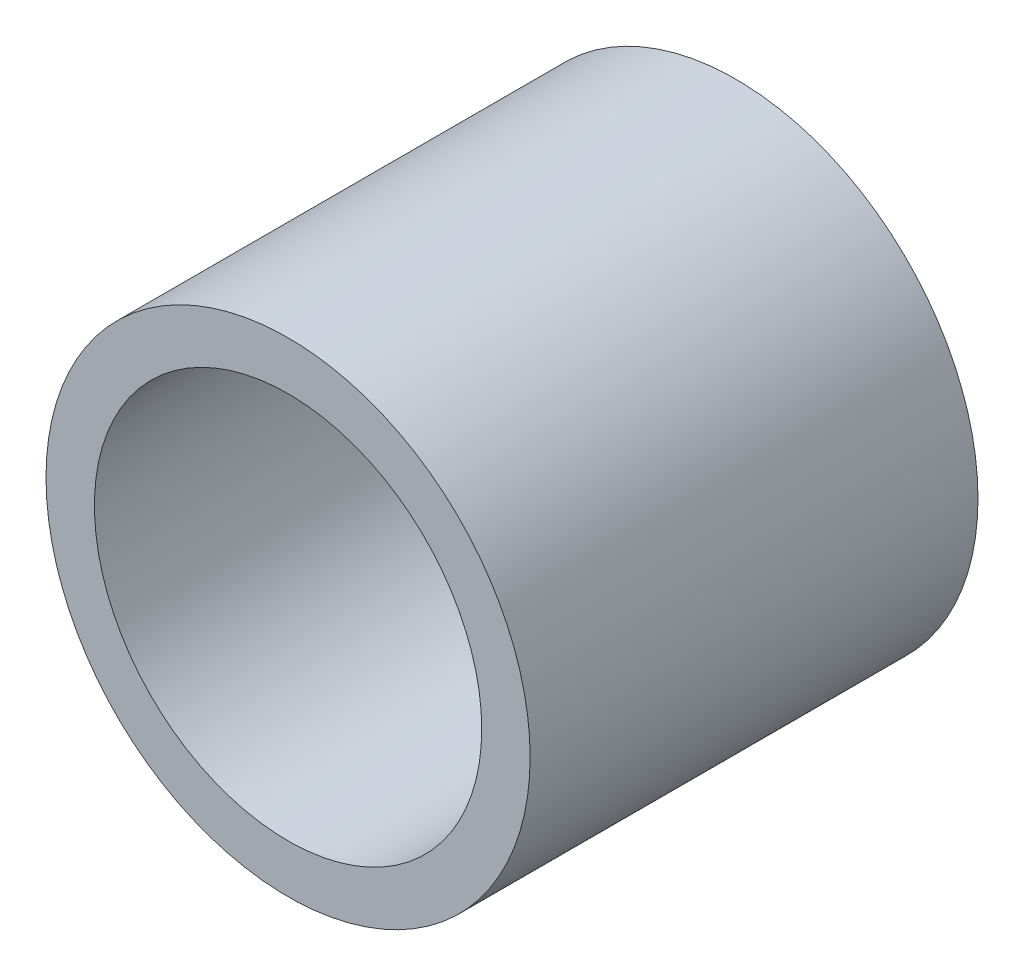
ISO-10303-21;
HEADER;
FILE_DESCRIPTION(('STEP AP214'),'2;1');
FILE_NAME('part.step','',(''),(''),'','','');
FILE_SCHEMA(('AUTOMOTIVE_DESIGN { 1 0 10303 214 1 1 1 1 }'));
ENDSEC;
DATA;
#1=APPLICATION_CONTEXT('core data for automotive mechanical design processes');
#2=APPLICATION_PROTOCOL_DEFINITION('international standard','automotive_design',2000,#1);
#3=PRODUCT_CONTEXT('',#1,'mechanical');
#4=PRODUCT('Part','Part','',(#3));
#5=PRODUCT_RELATED_PRODUCT_CATEGORY('part','',(#4));
#6=PRODUCT_DEFINITION_FORMATION('','',#4);
#7=PRODUCT_DEFINITION_CONTEXT('part definition',#1,'design');
#8=PRODUCT_DEFINITION('design','',#6,#7);
#9=PRODUCT_DEFINITION_SHAPE('','',#8);
#10=(LENGTH_UNIT() NAMED_UNIT(*) SI_UNIT(.MILLI.,.METRE.));
#11=(NAMED_UNIT(*) PLANE_ANGLE_UNIT() SI_UNIT($,.RADIAN.));
#12=(NAMED_UNIT(*) SI_UNIT($,.STERADIAN.) SOLID_ANGLE_UNIT());
#13=UNCERTAINTY_MEASURE_WITH_UNIT(LENGTH_MEASURE(1.E-05),#10,'distance_accuracy_value','');
#14=(GEOMETRIC_REPRESENTATION_CONTEXT(3) GLOBAL_UNCERTAINTY_ASSIGNED_CONTEXT((#13)) GLOBAL_UNIT_ASSIGNED_CONTEXT((#10,
#11,#12)) REPRESENTATION_CONTEXT('',''));
#15=CARTESIAN_POINT('',(0.,0.,0.));
#16=DIRECTION('',(0.,0.,1.));
#17=DIRECTION('',(1.,0.,0.));
#18=AXIS2_PLACEMENT_3D('',#15,#16,#17);
#19=CARTESIAN_POINT('',(0.,0.,9.25));
#20=DIRECTION('',(0.,0.,1.));
#21=DIRECTION('',(1.,0.,0.));
#22=AXIS2_PLACEMENT_3D('',#19,#20,#21);
#23=PLANE('',#22);
#24=CARTESIAN_POINT('',(0.,0.,9.25));
#25=DIRECTION('',(0.,0.,1.));
#26=DIRECTION('',(1.,0.,0.));
#27=AXIS2_PLACEMENT_3D('',#24,#25,#26);
#28=CIRCLE('',#27,5.);
#29=CARTESIAN_POINT('',(5.,0.,9.25));
#30=VERTEX_POINT('',#29);
#31=EDGE_CURVE('E11',#30,#30,#28,.T.);
#32=ORIENTED_EDGE('',*,*,#31,.T.);
#33=EDGE_LOOP('',(#32));
#34=FACE_BOUND('',#33,.T.);
#35=CARTESIAN_POINT('',(0.,0.,9.25));
#36=DIRECTION('',(0.,0.,1.));
#37=DIRECTION('',(1.,0.,0.));
#38=AXIS2_PLACEMENT_3D('',#35,#36,#37);
#39=CIRCLE('',#38,4.);
#40=CARTESIAN_POINT('',(4.,0.,9.25));
#41=VERTEX_POINT('',#40);
#42=EDGE_CURVE('E61',#41,#41,#39,.T.);
#43=ORIENTED_EDGE('',*,*,#42,.F.);
#44=EDGE_LOOP('',(#43));
#45=FACE_BOUND('',#44,.T.);
#46=ADVANCED_FACE('F51',(#34,#45),#23,.T.);
#47=CARTESIAN_POINT('',(0.,0.,0.));
#48=DIRECTION('',(0.,0.,1.));
#49=DIRECTION('',(1.,0.,0.));
#50=AXIS2_PLACEMENT_3D('',#47,#48,#49);
#51=PLANE('',#50);
#52=CARTESIAN_POINT('',(0.,0.,0.));
#53=DIRECTION('',(0.,0.,1.));
#54=DIRECTION('',(1.,0.,0.));
#55=AXIS2_PLACEMENT_3D('',#52,#53,#54);
#56=CIRCLE('',#55,5.);
#57=CARTESIAN_POINT('',(5.,0.,0.));
#58=VERTEX_POINT('',#57);
#59=EDGE_CURVE('E54',#58,#58,#56,.T.);
#60=ORIENTED_EDGE('',*,*,#59,.F.);
#61=EDGE_LOOP('',(#60));
#62=FACE_BOUND('',#61,.T.);
#63=CARTESIAN_POINT('',(0.,0.,0.));
#64=DIRECTION('',(0.,0.,1.));
#65=DIRECTION('',(1.,0.,0.));
#66=AXIS2_PLACEMENT_3D('',#63,#64,#65);
#67=CIRCLE('',#66,4.);
#68=CARTESIAN_POINT('',(4.,0.,0.));
#69=VERTEX_POINT('',#68);
#70=EDGE_CURVE('E67',#69,#69,#67,.T.);
#71=ORIENTED_EDGE('',*,*,#70,.T.);
#72=EDGE_LOOP('',(#71));
#73=FACE_BOUND('',#72,.T.);
#74=ADVANCED_FACE('F79',(#62,#73),#51,.F.);
#75=CARTESIAN_POINT('',(0.,0.,9.25));
#76=DIRECTION('',(0.,0.,-1.));
#77=DIRECTION('',(-1.,0.,0.));
#78=AXIS2_PLACEMENT_3D('',#75,#76,#77);
#79=CYLINDRICAL_SURFACE('',#78,5.);
#80=ORIENTED_EDGE('',*,*,#31,.F.);
#81=EDGE_LOOP('',(#80));
#82=FACE_BOUND('',#81,.T.);
#83=ORIENTED_EDGE('',*,*,#59,.T.);
#84=EDGE_LOOP('',(#83));
#85=FACE_BOUND('',#84,.T.);
#86=ADVANCED_FACE('F52',(#82,#85),#79,.T.);
#87=CARTESIAN_POINT('',(0.,0.,9.25));
#88=DIRECTION('',(0.,0.,-1.));
#89=DIRECTION('',(-1.,0.,0.));
#90=AXIS2_PLACEMENT_3D('',#87,#88,#89);
#91=CYLINDRICAL_SURFACE('',#90,4.);
#92=ORIENTED_EDGE('',*,*,#42,.T.);
#93=EDGE_LOOP('',(#92));
#94=FACE_BOUND('',#93,.T.);
#95=ORIENTED_EDGE('',*,*,#70,.F.);
#96=EDGE_LOOP('',(#95));
#97=FACE_BOUND('',#96,.T.);
#98=ADVANCED_FACE('F74',(#94,#97),#91,.F.);
#99=CLOSED_SHELL('',(#46,#74,#86,#98));
#100=MANIFOLD_SOLID_BREP('B2',#99);
#101=ADVANCED_BREP_SHAPE_REPRESENTATION('',(#18,#100),#14);
#102=SHAPE_DEFINITION_REPRESENTATION(#9,#101);
ENDSEC;
END-ISO-10303-21;
